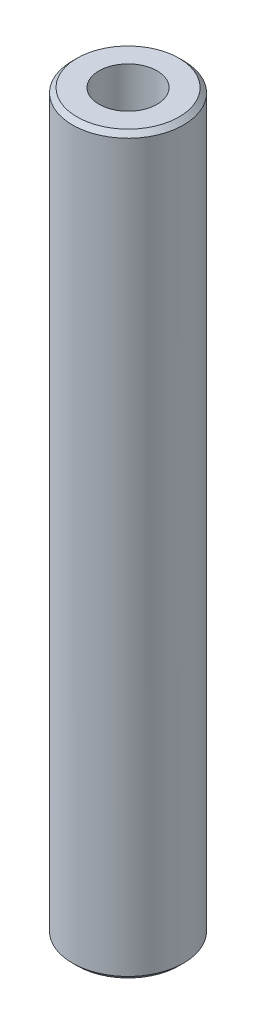
ISO-10303-21;
HEADER;
FILE_DESCRIPTION(('STEP AP214'),'2;1');
FILE_NAME('part.step','',(''),(''),'','','');
FILE_SCHEMA(('AUTOMOTIVE_DESIGN { 1 0 10303 214 1 1 1 1 }'));
ENDSEC;
DATA;
#1=APPLICATION_CONTEXT('core data for automotive mechanical design processes');
#2=APPLICATION_PROTOCOL_DEFINITION('international standard','automotive_design',2000,#1);
#3=PRODUCT_CONTEXT('',#1,'mechanical');
#4=PRODUCT('Part','Part','',(#3));
#5=PRODUCT_RELATED_PRODUCT_CATEGORY('part','',(#4));
#6=PRODUCT_DEFINITION_FORMATION('','',#4);
#7=PRODUCT_DEFINITION_CONTEXT('part definition',#1,'design');
#8=PRODUCT_DEFINITION('design','',#6,#7);
#9=PRODUCT_DEFINITION_SHAPE('','',#8);
#10=(LENGTH_UNIT() NAMED_UNIT(*) SI_UNIT(.MILLI.,.METRE.));
#11=(NAMED_UNIT(*) PLANE_ANGLE_UNIT() SI_UNIT($,.RADIAN.));
#12=(NAMED_UNIT(*) SI_UNIT($,.STERADIAN.) SOLID_ANGLE_UNIT());
#13=UNCERTAINTY_MEASURE_WITH_UNIT(LENGTH_MEASURE(1.E-05),#10,'distance_accuracy_value','');
#14=(GEOMETRIC_REPRESENTATION_CONTEXT(3) GLOBAL_UNCERTAINTY_ASSIGNED_CONTEXT((#13)) GLOBAL_UNIT_ASSIGNED_CONTEXT((#10,
#11,#12)) REPRESENTATION_CONTEXT('',''));
#15=CARTESIAN_POINT('',(0.,0.,0.));
#16=DIRECTION('',(0.,0.,1.));
#17=DIRECTION('',(1.,0.,0.));
#18=AXIS2_PLACEMENT_3D('',#15,#16,#17);
#19=CARTESIAN_POINT('',(0.,31.496,0.));
#20=DIRECTION('',(0.,-1.,0.));
#21=DIRECTION('',(0.,0.,-1.));
#22=AXIS2_PLACEMENT_3D('',#19,#20,#21);
#23=CYLINDRICAL_SURFACE('',#22,4.7625);
#24=CARTESIAN_POINT('',(0.,-31.099125,0.));
#25=DIRECTION('',(0.,1.,0.));
#26=DIRECTION('',(0.,0.,1.));
#27=AXIS2_PLACEMENT_3D('',#24,#25,#26);
#28=CIRCLE('',#27,4.7625);
#29=CARTESIAN_POINT('',(0.,-31.099125,4.7625));
#30=VERTEX_POINT('',#29);
#31=EDGE_CURVE('E45',#30,#30,#28,.T.);
#32=ORIENTED_EDGE('',*,*,#31,.T.);
#33=EDGE_LOOP('',(#32));
#34=FACE_BOUND('',#33,.T.);
#35=CARTESIAN_POINT('',(0.,31.099125,0.));
#36=DIRECTION('',(0.,1.,0.));
#37=DIRECTION('',(0.,0.,1.));
#38=AXIS2_PLACEMENT_3D('',#35,#36,#37);
#39=CIRCLE('',#38,4.7625);
#40=CARTESIAN_POINT('',(0.,31.099125,-4.7625));
#41=VERTEX_POINT('',#40);
#42=EDGE_CURVE('E49',#41,#41,#39,.F.);
#43=ORIENTED_EDGE('',*,*,#42,.T.);
#44=EDGE_LOOP('',(#43));
#45=FACE_BOUND('',#44,.T.);
#46=ADVANCED_FACE('F33',(#34,#45),#23,.T.);
#47=CARTESIAN_POINT('',(0.,31.496,0.));
#48=DIRECTION('',(0.,1.,0.));
#49=DIRECTION('',(0.,0.,1.));
#50=AXIS2_PLACEMENT_3D('',#47,#48,#49);
#51=PLANE('',#50);
#52=CARTESIAN_POINT('',(0.,31.496,0.));
#53=DIRECTION('',(0.,1.,0.));
#54=DIRECTION('',(0.,0.,1.));
#55=AXIS2_PLACEMENT_3D('',#52,#53,#54);
#56=CIRCLE('',#55,2.4892);
#57=CARTESIAN_POINT('',(0.,31.496,2.4892));
#58=VERTEX_POINT('',#57);
#59=EDGE_CURVE('E57',#58,#58,#56,.T.);
#60=ORIENTED_EDGE('',*,*,#59,.F.);
#61=EDGE_LOOP('',(#60));
#62=FACE_BOUND('',#61,.T.);
#63=CARTESIAN_POINT('',(0.,31.496,0.));
#64=DIRECTION('',(0.,1.,0.));
#65=DIRECTION('',(0.,0.,1.));
#66=AXIS2_PLACEMENT_3D('',#63,#64,#65);
#67=CIRCLE('',#66,4.36562499999999);
#68=CARTESIAN_POINT('',(0.,31.496,-4.36562499999999));
#69=VERTEX_POINT('',#68);
#70=EDGE_CURVE('E10',#69,#69,#67,.T.);
#71=ORIENTED_EDGE('',*,*,#70,.T.);
#72=EDGE_LOOP('',(#71));
#73=FACE_BOUND('',#72,.T.);
#74=ADVANCED_FACE('F63',(#62,#73),#51,.T.);
#75=CARTESIAN_POINT('',(0.,-31.496,0.));
#76=DIRECTION('',(0.,1.,0.));
#77=DIRECTION('',(0.,0.,1.));
#78=AXIS2_PLACEMENT_3D('',#75,#76,#77);
#79=PLANE('',#78);
#80=CARTESIAN_POINT('',(0.,-31.496,0.));
#81=DIRECTION('',(0.,1.,0.));
#82=DIRECTION('',(0.,0.,1.));
#83=AXIS2_PLACEMENT_3D('',#80,#81,#82);
#84=CIRCLE('',#83,2.4892);
#85=CARTESIAN_POINT('',(0.,-31.496,2.4892));
#86=VERTEX_POINT('',#85);
#87=EDGE_CURVE('E54',#86,#86,#84,.T.);
#88=ORIENTED_EDGE('',*,*,#87,.T.);
#89=EDGE_LOOP('',(#88));
#90=FACE_BOUND('',#89,.T.);
#91=CARTESIAN_POINT('',(0.,-31.496,0.));
#92=DIRECTION('',(0.,1.,0.));
#93=DIRECTION('',(0.,0.,1.));
#94=AXIS2_PLACEMENT_3D('',#91,#92,#93);
#95=CIRCLE('',#94,4.365625);
#96=CARTESIAN_POINT('',(0.,-31.496,4.365625));
#97=VERTEX_POINT('',#96);
#98=EDGE_CURVE('E41',#97,#97,#95,.F.);
#99=ORIENTED_EDGE('',*,*,#98,.T.);
#100=EDGE_LOOP('',(#99));
#101=FACE_BOUND('',#100,.T.);
#102=ADVANCED_FACE('F65',(#90,#101),#79,.F.);
#103=CARTESIAN_POINT('',(0.,-31.099125,0.));
#104=DIRECTION('',(0.,1.,0.));
#105=DIRECTION('',(0.,0.,1.));
#106=AXIS2_PLACEMENT_3D('',#103,#104,#105);
#107=CONICAL_SURFACE('',#106,4.7625,0.785398163397436);
#108=ORIENTED_EDGE('',*,*,#98,.F.);
#109=EDGE_LOOP('',(#108));
#110=FACE_BOUND('',#109,.T.);
#111=ORIENTED_EDGE('',*,*,#31,.F.);
#112=EDGE_LOOP('',(#111));
#113=FACE_BOUND('',#112,.T.);
#114=ADVANCED_FACE('F71',(#110,#113),#107,.T.);
#115=CARTESIAN_POINT('',(0.,31.496,0.));
#116=DIRECTION('',(0.,-1.,0.));
#117=DIRECTION('',(0.,0.,-1.));
#118=AXIS2_PLACEMENT_3D('',#115,#116,#117);
#119=CONICAL_SURFACE('',#118,4.36562499999999,0.785398163397458);
#120=CARTESIAN_POINT('',(0.,31.099125,-4.7625));
#121=CARTESIAN_POINT('',(0.,31.1032591145833,-4.75836588541667));
#122=CARTESIAN_POINT('',(0.,31.1073932291667,-4.75423177083333));
#123=CARTESIAN_POINT('',(0.,31.1156614583333,-4.74596354166667));
#124=CARTESIAN_POINT('',(0.,31.1197955729167,-4.74182942708333));
#125=CARTESIAN_POINT('',(0.,31.1280638020833,-4.73356119791667));
#126=CARTESIAN_POINT('',(0.,31.1321979166667,-4.72942708333333));
#127=CARTESIAN_POINT('',(0.,31.1404661458333,-4.72115885416667));
#128=CARTESIAN_POINT('',(0.,31.1446002604167,-4.71702473958333));
#129=CARTESIAN_POINT('',(0.,31.1528684895833,-4.70875651041667));
#130=CARTESIAN_POINT('',(0.,31.1570026041667,-4.70462239583333));
#131=CARTESIAN_POINT('',(0.,31.1652708333333,-4.69635416666667));
#132=CARTESIAN_POINT('',(0.,31.1694049479167,-4.69222005208333));
#133=CARTESIAN_POINT('',(0.,31.1776731770833,-4.68395182291667));
#134=CARTESIAN_POINT('',(0.,31.1818072916667,-4.67981770833333));
#135=CARTESIAN_POINT('',(0.,31.1900755208333,-4.67154947916667));
#136=CARTESIAN_POINT('',(0.,31.1942096354167,-4.66741536458333));
#137=CARTESIAN_POINT('',(0.,31.2024778645833,-4.65914713541667));
#138=CARTESIAN_POINT('',(0.,31.2066119791667,-4.65501302083333));
#139=CARTESIAN_POINT('',(0.,31.2148802083333,-4.64674479166667));
#140=CARTESIAN_POINT('',(0.,31.2190143229167,-4.64261067708333));
#141=CARTESIAN_POINT('',(0.,31.2272825520833,-4.63434244791667));
#142=CARTESIAN_POINT('',(0.,31.2314166666667,-4.63020833333333));
#143=CARTESIAN_POINT('',(0.,31.2396848958333,-4.62194010416667));
#144=CARTESIAN_POINT('',(0.,31.2438190104167,-4.61780598958333));
#145=CARTESIAN_POINT('',(0.,31.2520872395833,-4.60953776041667));
#146=CARTESIAN_POINT('',(0.,31.2562213541667,-4.60540364583333));
#147=CARTESIAN_POINT('',(0.,31.2644895833333,-4.59713541666667));
#148=CARTESIAN_POINT('',(0.,31.2686236979167,-4.59300130208333));
#149=CARTESIAN_POINT('',(0.,31.2768919270833,-4.58473307291667));
#150=CARTESIAN_POINT('',(0.,31.2810260416667,-4.58059895833333));
#151=CARTESIAN_POINT('',(0.,31.2892942708333,-4.57233072916666));
#152=CARTESIAN_POINT('',(0.,31.2934283854167,-4.56819661458333));
#153=CARTESIAN_POINT('',(0.,31.3016966145833,-4.55992838541667));
#154=CARTESIAN_POINT('',(0.,31.3058307291667,-4.55579427083333));
#155=CARTESIAN_POINT('',(0.,31.3140989583333,-4.54752604166667));
#156=CARTESIAN_POINT('',(0.,31.3182330729167,-4.54339192708333));
#157=CARTESIAN_POINT('',(0.,31.3265013020833,-4.53512369791666));
#158=CARTESIAN_POINT('',(0.,31.3306354166667,-4.53098958333333));
#159=CARTESIAN_POINT('',(0.,31.3389036458333,-4.52272135416667));
#160=CARTESIAN_POINT('',(0.,31.3430377604167,-4.51858723958333));
#161=CARTESIAN_POINT('',(0.,31.3513059895833,-4.51031901041666));
#162=CARTESIAN_POINT('',(0.,31.3554401041667,-4.50618489583333));
#163=CARTESIAN_POINT('',(0.,31.3637083333333,-4.49791666666666));
#164=CARTESIAN_POINT('',(0.,31.3678424479167,-4.49378255208333));
#165=CARTESIAN_POINT('',(0.,31.3761106770833,-4.48551432291666));
#166=CARTESIAN_POINT('',(0.,31.3802447916667,-4.48138020833333));
#167=CARTESIAN_POINT('',(0.,31.3885130208333,-4.47311197916666));
#168=CARTESIAN_POINT('',(0.,31.3926471354167,-4.46897786458333));
#169=CARTESIAN_POINT('',(0.,31.4009153645833,-4.46070963541666));
#170=CARTESIAN_POINT('',(0.,31.4050494791667,-4.45657552083333));
#171=CARTESIAN_POINT('',(0.,31.4133177083333,-4.44830729166666));
#172=CARTESIAN_POINT('',(0.,31.4174518229167,-4.44417317708333));
#173=CARTESIAN_POINT('',(0.,31.4257200520833,-4.43590494791666));
#174=CARTESIAN_POINT('',(0.,31.4298541666667,-4.43177083333333));
#175=CARTESIAN_POINT('',(0.,31.4381223958333,-4.42350260416666));
#176=CARTESIAN_POINT('',(0.,31.4422565104167,-4.41936848958333));
#177=CARTESIAN_POINT('',(0.,31.4505247395833,-4.41110026041666));
#178=CARTESIAN_POINT('',(0.,31.4546588541667,-4.40696614583333));
#179=CARTESIAN_POINT('',(0.,31.4629270833333,-4.39869791666666));
#180=CARTESIAN_POINT('',(0.,31.4670611979167,-4.39456380208333));
#181=CARTESIAN_POINT('',(0.,31.4753294270833,-4.38629557291666));
#182=CARTESIAN_POINT('',(0.,31.4794635416667,-4.38216145833333));
#183=CARTESIAN_POINT('',(0.,31.4877317708333,-4.37389322916666));
#184=CARTESIAN_POINT('',(0.,31.4918658854167,-4.36975911458333));
#185=CARTESIAN_POINT('',(0.,31.496,-4.36562499999999));
#186=B_SPLINE_CURVE_WITH_KNOTS('',3,(#120,#121,#122,#123,#124,#125,#126,#127,#128,#129,#130,
#131,#132,#133,#134,#135,#136,#137,#138,#139,#140,#141,#142,#143,#144,#145,#146,#147,#148,#149,
#150,#151,#152,#153,#154,#155,#156,#157,#158,#159,#160,#161,#162,#163,#164,#165,#166,#167,#168,
#169,#170,#171,#172,#173,#174,#175,#176,#177,#178,#179,#180,#181,#182,#183,#184,#185),
.UNSPECIFIED.,.F.,.F.,(4,2,2,2,2,2,2,2,2,2,2,2,2,2,2,2,2,2,2,2,2,2,2,2,2,2,2,2,2,2,2,2,4),(0.,
0.0175395627364628,0.035079125472925,0.0526186882093878,0.0701582509458524,0.0876978136823152,
0.105237376418778,0.122776939155243,0.140316501891705,0.157856064628168,0.175395627364633,
0.192935190101096,0.210474752837558,0.228014315574023,0.245553878310488,0.263093441046948,
0.280633003783413,0.298172566519878,0.315712129256338,0.333251691992803,0.350791254729268,
0.368330817465728,0.385870380202193,0.403409942938658,0.420949505675118,0.438489068411583,
0.456028631148048,0.473568193884508,0.491107756620974,0.508647319357438,0.526186882093898,
0.543726444830363,0.561266007566828),.UNSPECIFIED.);
#187=EDGE_CURVE('BSEAM36',#41,#69,#186,.T.);
#188=ORIENTED_EDGE('',*,*,#42,.F.);
#189=ORIENTED_EDGE('',*,*,#70,.F.);
#190=ORIENTED_EDGE('',*,*,#187,.T.);
#191=ORIENTED_EDGE('',*,*,#187,.F.);
#192=EDGE_LOOP('',(#188,#190,#189,#191));
#193=FACE_BOUND('',#192,.T.);
#194=ADVANCED_FACE('F36',(#193),#119,.T.);
#195=CARTESIAN_POINT('',(0.,-31.496,0.));
#196=DIRECTION('',(0.,1.,0.));
#197=DIRECTION('',(0.,0.,1.));
#198=AXIS2_PLACEMENT_3D('',#195,#196,#197);
#199=CYLINDRICAL_SURFACE('',#198,2.4892);
#200=ORIENTED_EDGE('',*,*,#87,.F.);
#201=EDGE_LOOP('',(#200));
#202=FACE_BOUND('',#201,.T.);
#203=ORIENTED_EDGE('',*,*,#59,.T.);
#204=EDGE_LOOP('',(#203));
#205=FACE_BOUND('',#204,.T.);
#206=ADVANCED_FACE('F61',(#202,#205),#199,.F.);
#207=CLOSED_SHELL('',(#46,#74,#102,#114,#194,#206));
#208=MANIFOLD_SOLID_BREP('B2',#207);
#209=ADVANCED_BREP_SHAPE_REPRESENTATION('',(#18,#208),#14);
#210=SHAPE_DEFINITION_REPRESENTATION(#9,#209);
ENDSEC;
END-ISO-10303-21;
